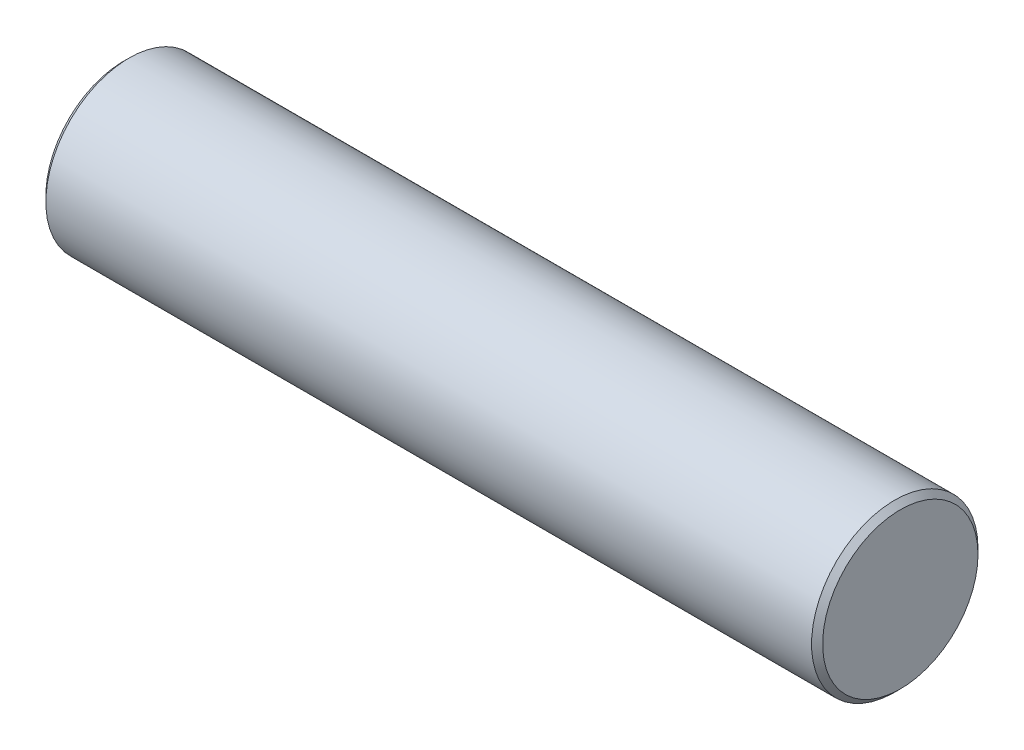
ISO-10303-21;
HEADER;
FILE_DESCRIPTION(('STEP AP214'),'2;1');
FILE_NAME('part.step','',(''),(''),'','','');
FILE_SCHEMA(('AUTOMOTIVE_DESIGN { 1 0 10303 214 1 1 1 1 }'));
ENDSEC;
DATA;
#1=APPLICATION_CONTEXT('core data for automotive mechanical design processes');
#2=APPLICATION_PROTOCOL_DEFINITION('international standard','automotive_design',2000,#1);
#3=PRODUCT_CONTEXT('',#1,'mechanical');
#4=PRODUCT('Part','Part','',(#3));
#5=PRODUCT_RELATED_PRODUCT_CATEGORY('part','',(#4));
#6=PRODUCT_DEFINITION_FORMATION('','',#4);
#7=PRODUCT_DEFINITION_CONTEXT('part definition',#1,'design');
#8=PRODUCT_DEFINITION('design','',#6,#7);
#9=PRODUCT_DEFINITION_SHAPE('','',#8);
#10=(LENGTH_UNIT() NAMED_UNIT(*) SI_UNIT(.MILLI.,.METRE.));
#11=(NAMED_UNIT(*) PLANE_ANGLE_UNIT() SI_UNIT($,.RADIAN.));
#12=(NAMED_UNIT(*) SI_UNIT($,.STERADIAN.) SOLID_ANGLE_UNIT());
#13=UNCERTAINTY_MEASURE_WITH_UNIT(LENGTH_MEASURE(1.E-05),#10,'distance_accuracy_value','');
#14=(GEOMETRIC_REPRESENTATION_CONTEXT(3) GLOBAL_UNCERTAINTY_ASSIGNED_CONTEXT((#13)) GLOBAL_UNIT_ASSIGNED_CONTEXT((#10,
#11,#12)) REPRESENTATION_CONTEXT('',''));
#15=CARTESIAN_POINT('',(0.,0.,0.));
#16=DIRECTION('',(0.,0.,1.));
#17=DIRECTION('',(1.,0.,0.));
#18=AXIS2_PLACEMENT_3D('',#15,#16,#17);
#19=CARTESIAN_POINT('',(14.,0.,0.));
#20=DIRECTION('',(-1.,0.,0.));
#21=DIRECTION('',(0.,0.,1.));
#22=AXIS2_PLACEMENT_3D('',#19,#20,#21);
#23=CYLINDRICAL_SURFACE('',#22,1.5);
#24=CARTESIAN_POINT('',(0.0999999999999994,0.,0.));
#25=DIRECTION('',(1.,0.,0.));
#26=DIRECTION('',(0.,0.,-1.));
#27=AXIS2_PLACEMENT_3D('',#24,#25,#26);
#28=CIRCLE('',#27,1.5);
#29=CARTESIAN_POINT('',(0.0999999999999994,0.,-1.5));
#30=VERTEX_POINT('',#29);
#31=EDGE_CURVE('E57',#30,#30,#28,.T.);
#32=ORIENTED_EDGE('',*,*,#31,.T.);
#33=EDGE_LOOP('',(#32));
#34=FACE_BOUND('',#33,.T.);
#35=CARTESIAN_POINT('',(13.9,0.,0.));
#36=DIRECTION('',(1.,0.,0.));
#37=DIRECTION('',(0.,0.,-1.));
#38=AXIS2_PLACEMENT_3D('',#35,#36,#37);
#39=CIRCLE('',#38,1.5);
#40=CARTESIAN_POINT('',(13.9,0.,-1.5));
#41=VERTEX_POINT('',#40);
#42=EDGE_CURVE('E61',#41,#41,#39,.F.);
#43=ORIENTED_EDGE('',*,*,#42,.T.);
#44=EDGE_LOOP('',(#43));
#45=FACE_BOUND('',#44,.T.);
#46=ADVANCED_FACE('F45',(#34,#45),#23,.T.);
#47=CARTESIAN_POINT('',(14.,0.,0.));
#48=DIRECTION('',(1.,0.,0.));
#49=DIRECTION('',(0.,0.,-1.));
#50=AXIS2_PLACEMENT_3D('',#47,#48,#49);
#51=PLANE('',#50);
#52=CARTESIAN_POINT('',(14.,0.,0.));
#53=DIRECTION('',(1.,0.,0.));
#54=DIRECTION('',(0.,0.,-1.));
#55=AXIS2_PLACEMENT_3D('',#52,#53,#54);
#56=CIRCLE('',#55,1.4);
#57=CARTESIAN_POINT('',(14.,0.,-1.4));
#58=VERTEX_POINT('',#57);
#59=EDGE_CURVE('E10',#58,#58,#56,.T.);
#60=ORIENTED_EDGE('',*,*,#59,.T.);
#61=EDGE_LOOP('',(#60));
#62=FACE_BOUND('',#61,.T.);
#63=ADVANCED_FACE('F77',(#62),#51,.T.);
#64=CARTESIAN_POINT('',(0.,0.,0.));
#65=DIRECTION('',(1.,0.,0.));
#66=DIRECTION('',(0.,0.,-1.));
#67=AXIS2_PLACEMENT_3D('',#64,#65,#66);
#68=PLANE('',#67);
#69=CARTESIAN_POINT('',(0.,0.,0.));
#70=DIRECTION('',(1.,0.,0.));
#71=DIRECTION('',(0.,0.,-1.));
#72=AXIS2_PLACEMENT_3D('',#69,#70,#71);
#73=CIRCLE('',#72,1.4);
#74=CARTESIAN_POINT('',(0.,0.,-1.4));
#75=VERTEX_POINT('',#74);
#76=EDGE_CURVE('E53',#75,#75,#73,.F.);
#77=ORIENTED_EDGE('',*,*,#76,.T.);
#78=EDGE_LOOP('',(#77));
#79=FACE_BOUND('',#78,.T.);
#80=ADVANCED_FACE('F74',(#79),#68,.F.);
#81=CARTESIAN_POINT('',(0.0999999999999994,0.,0.));
#82=DIRECTION('',(1.,0.,0.));
#83=DIRECTION('',(0.,0.,-1.));
#84=AXIS2_PLACEMENT_3D('',#81,#82,#83);
#85=CONICAL_SURFACE('',#84,1.5,0.785398163397458);
#86=ORIENTED_EDGE('',*,*,#76,.F.);
#87=EDGE_LOOP('',(#86));
#88=FACE_BOUND('',#87,.T.);
#89=ORIENTED_EDGE('',*,*,#31,.F.);
#90=EDGE_LOOP('',(#89));
#91=FACE_BOUND('',#90,.T.);
#92=ADVANCED_FACE('F70',(#88,#91),#85,.T.);
#93=CARTESIAN_POINT('',(14.,0.,0.));
#94=DIRECTION('',(-1.,0.,0.));
#95=DIRECTION('',(0.,0.,1.));
#96=AXIS2_PLACEMENT_3D('',#93,#94,#95);
#97=CONICAL_SURFACE('',#96,1.4,0.785398163397448);
#98=ORIENTED_EDGE('',*,*,#42,.F.);
#99=EDGE_LOOP('',(#98));
#100=FACE_BOUND('',#99,.T.);
#101=ORIENTED_EDGE('',*,*,#59,.F.);
#102=EDGE_LOOP('',(#101));
#103=FACE_BOUND('',#102,.T.);
#104=ADVANCED_FACE('F48',(#100,#103),#97,.T.);
#105=CLOSED_SHELL('',(#46,#63,#80,#92,#104));
#106=MANIFOLD_SOLID_BREP('B2',#105);
#107=ADVANCED_BREP_SHAPE_REPRESENTATION('',(#18,#106),#14);
#108=SHAPE_DEFINITION_REPRESENTATION(#9,#107);
ENDSEC;
END-ISO-10303-21;
